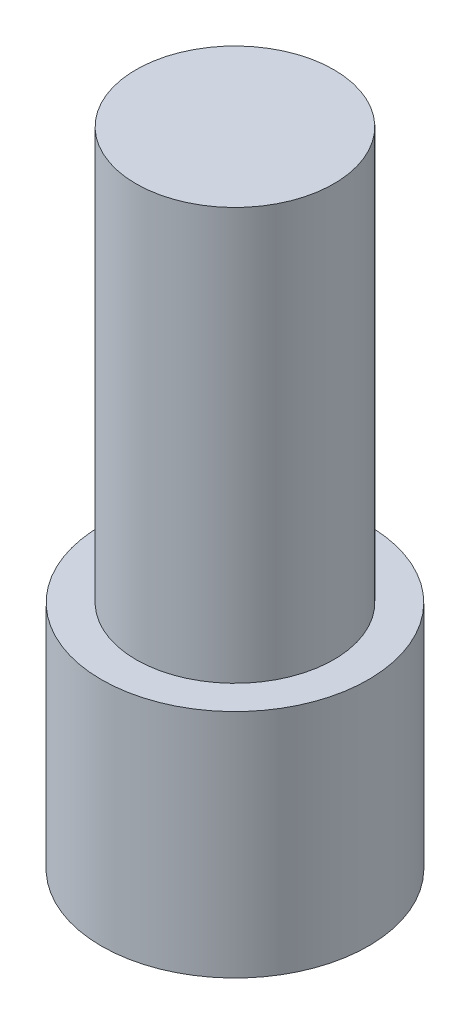
ISO-10303-21;
HEADER;
FILE_DESCRIPTION(('STEP AP214'),'2;1');
FILE_NAME('part.step','',(''),(''),'','','');
FILE_SCHEMA(('AUTOMOTIVE_DESIGN { 1 0 10303 214 1 1 1 1 }'));
ENDSEC;
DATA;
#1=APPLICATION_CONTEXT('core data for automotive mechanical design processes');
#2=APPLICATION_PROTOCOL_DEFINITION('international standard','automotive_design',2000,#1);
#3=PRODUCT_CONTEXT('',#1,'mechanical');
#4=PRODUCT('Part','Part','',(#3));
#5=PRODUCT_RELATED_PRODUCT_CATEGORY('part','',(#4));
#6=PRODUCT_DEFINITION_FORMATION('','',#4);
#7=PRODUCT_DEFINITION_CONTEXT('part definition',#1,'design');
#8=PRODUCT_DEFINITION('design','',#6,#7);
#9=PRODUCT_DEFINITION_SHAPE('','',#8);
#10=(LENGTH_UNIT() NAMED_UNIT(*) SI_UNIT(.MILLI.,.METRE.));
#11=(NAMED_UNIT(*) PLANE_ANGLE_UNIT() SI_UNIT($,.RADIAN.));
#12=(NAMED_UNIT(*) SI_UNIT($,.STERADIAN.) SOLID_ANGLE_UNIT());
#13=UNCERTAINTY_MEASURE_WITH_UNIT(LENGTH_MEASURE(1.E-05),#10,'distance_accuracy_value','');
#14=(GEOMETRIC_REPRESENTATION_CONTEXT(3) GLOBAL_UNCERTAINTY_ASSIGNED_CONTEXT((#13)) GLOBAL_UNIT_ASSIGNED_CONTEXT((#10,
#11,#12)) REPRESENTATION_CONTEXT('',''));
#15=CARTESIAN_POINT('',(0.,0.,0.));
#16=DIRECTION('',(0.,0.,1.));
#17=DIRECTION('',(1.,0.,0.));
#18=AXIS2_PLACEMENT_3D('',#15,#16,#17);
#19=CARTESIAN_POINT('',(0.,7.,0.));
#20=DIRECTION('',(0.,-1.,0.));
#21=DIRECTION('',(0.,0.,-1.));
#22=AXIS2_PLACEMENT_3D('',#19,#20,#21);
#23=CYLINDRICAL_SURFACE('',#22,4.05);
#24=CARTESIAN_POINT('',(0.,7.,0.));
#25=DIRECTION('',(0.,1.,0.));
#26=DIRECTION('',(0.,0.,1.));
#27=AXIS2_PLACEMENT_3D('',#24,#25,#26);
#28=CIRCLE('',#27,4.05);
#29=CARTESIAN_POINT('',(0.,7.,4.05));
#30=VERTEX_POINT('',#29);
#31=EDGE_CURVE('E44',#30,#30,#28,.T.);
#32=ORIENTED_EDGE('',*,*,#31,.F.);
#33=EDGE_LOOP('',(#32));
#34=FACE_BOUND('',#33,.T.);
#35=CARTESIAN_POINT('',(0.,0.,0.));
#36=DIRECTION('',(0.,1.,0.));
#37=DIRECTION('',(0.,0.,1.));
#38=AXIS2_PLACEMENT_3D('',#35,#36,#37);
#39=CIRCLE('',#38,4.05);
#40=CARTESIAN_POINT('',(0.,0.,4.05));
#41=VERTEX_POINT('',#40);
#42=EDGE_CURVE('E40',#41,#41,#39,.T.);
#43=ORIENTED_EDGE('',*,*,#42,.T.);
#44=EDGE_LOOP('',(#43));
#45=FACE_BOUND('',#44,.T.);
#46=ADVANCED_FACE('F37',(#34,#45),#23,.T.);
#47=CARTESIAN_POINT('',(0.,7.,0.));
#48=DIRECTION('',(0.,1.,0.));
#49=DIRECTION('',(0.,0.,1.));
#50=AXIS2_PLACEMENT_3D('',#47,#48,#49);
#51=PLANE('',#50);
#52=CARTESIAN_POINT('',(0.,7.,0.));
#53=DIRECTION('',(0.,1.,0.));
#54=DIRECTION('',(0.,0.,1.));
#55=AXIS2_PLACEMENT_3D('',#52,#53,#54);
#56=CIRCLE('',#55,3.);
#57=CARTESIAN_POINT('',(0.,7.,3.));
#58=VERTEX_POINT('',#57);
#59=EDGE_CURVE('E10',#58,#58,#56,.T.);
#60=ORIENTED_EDGE('',*,*,#59,.F.);
#61=EDGE_LOOP('',(#60));
#62=FACE_BOUND('',#61,.T.);
#63=ORIENTED_EDGE('',*,*,#31,.T.);
#64=EDGE_LOOP('',(#63));
#65=FACE_BOUND('',#64,.T.);
#66=ADVANCED_FACE('F61',(#62,#65),#51,.T.);
#67=CARTESIAN_POINT('',(0.,0.,0.));
#68=DIRECTION('',(0.,1.,0.));
#69=DIRECTION('',(0.,0.,1.));
#70=AXIS2_PLACEMENT_3D('',#67,#68,#69);
#71=PLANE('',#70);
#72=ORIENTED_EDGE('',*,*,#42,.F.);
#73=EDGE_LOOP('',(#72));
#74=FACE_BOUND('',#73,.T.);
#75=ADVANCED_FACE('F58',(#74),#71,.F.);
#76=CARTESIAN_POINT('',(0.,19.5,0.));
#77=DIRECTION('',(0.,-1.,0.));
#78=DIRECTION('',(0.,0.,-1.));
#79=AXIS2_PLACEMENT_3D('',#76,#77,#78);
#80=CYLINDRICAL_SURFACE('',#79,3.);
#81=CARTESIAN_POINT('',(0.,19.5,0.));
#82=DIRECTION('',(0.,1.,0.));
#83=DIRECTION('',(0.,0.,1.));
#84=AXIS2_PLACEMENT_3D('',#81,#82,#83);
#85=CIRCLE('',#84,3.);
#86=CARTESIAN_POINT('',(0.,19.5,3.));
#87=VERTEX_POINT('',#86);
#88=EDGE_CURVE('E50',#87,#87,#85,.T.);
#89=ORIENTED_EDGE('',*,*,#88,.F.);
#90=EDGE_LOOP('',(#89));
#91=FACE_BOUND('',#90,.T.);
#92=ORIENTED_EDGE('',*,*,#59,.T.);
#93=EDGE_LOOP('',(#92));
#94=FACE_BOUND('',#93,.T.);
#95=ADVANCED_FACE('F60',(#91,#94),#80,.T.);
#96=CARTESIAN_POINT('',(0.,19.5,0.));
#97=DIRECTION('',(0.,1.,0.));
#98=DIRECTION('',(0.,0.,1.));
#99=AXIS2_PLACEMENT_3D('',#96,#97,#98);
#100=PLANE('',#99);
#101=ORIENTED_EDGE('',*,*,#88,.T.);
#102=EDGE_LOOP('',(#101));
#103=FACE_BOUND('',#102,.T.);
#104=ADVANCED_FACE('F67',(#103),#100,.T.);
#105=CLOSED_SHELL('',(#46,#66,#75,#95,#104));
#106=MANIFOLD_SOLID_BREP('B2',#105);
#107=ADVANCED_BREP_SHAPE_REPRESENTATION('',(#18,#106),#14);
#108=SHAPE_DEFINITION_REPRESENTATION(#9,#107);
ENDSEC;
END-ISO-10303-21;
